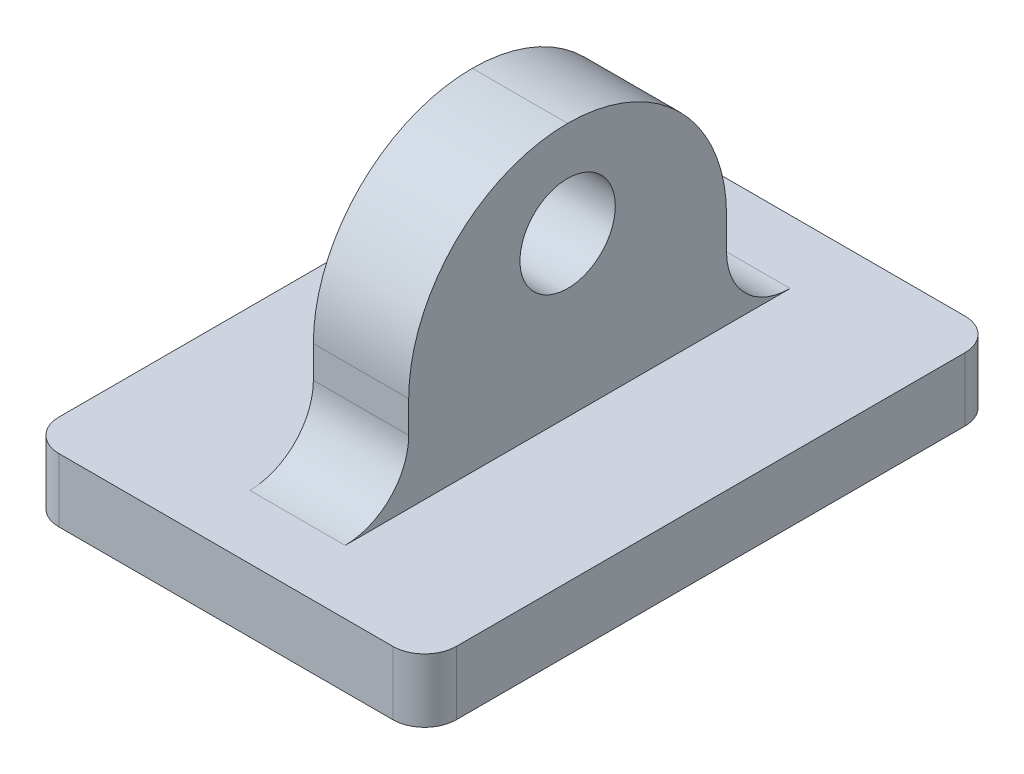
ISO-10303-21;
HEADER;
FILE_DESCRIPTION(('STEP AP214'),'2;1');
FILE_NAME('part.step','',(''),(''),'','','');
FILE_SCHEMA(('AUTOMOTIVE_DESIGN { 1 0 10303 214 1 1 1 1 }'));
ENDSEC;
DATA;
#1=APPLICATION_CONTEXT('core data for automotive mechanical design processes');
#2=APPLICATION_PROTOCOL_DEFINITION('international standard','automotive_design',2000,#1);
#3=PRODUCT_CONTEXT('',#1,'mechanical');
#4=PRODUCT('Part','Part','',(#3));
#5=PRODUCT_RELATED_PRODUCT_CATEGORY('part','',(#4));
#6=PRODUCT_DEFINITION_FORMATION('','',#4);
#7=PRODUCT_DEFINITION_CONTEXT('part definition',#1,'design');
#8=PRODUCT_DEFINITION('design','',#6,#7);
#9=PRODUCT_DEFINITION_SHAPE('','',#8);
#10=(LENGTH_UNIT() NAMED_UNIT(*) SI_UNIT(.MILLI.,.METRE.));
#11=(NAMED_UNIT(*) PLANE_ANGLE_UNIT() SI_UNIT($,.RADIAN.));
#12=(NAMED_UNIT(*) SI_UNIT($,.STERADIAN.) SOLID_ANGLE_UNIT());
#13=UNCERTAINTY_MEASURE_WITH_UNIT(LENGTH_MEASURE(1.E-05),#10,'distance_accuracy_value','');
#14=(GEOMETRIC_REPRESENTATION_CONTEXT(3) GLOBAL_UNCERTAINTY_ASSIGNED_CONTEXT((#13)) GLOBAL_UNIT_ASSIGNED_CONTEXT((#10,
#11,#12)) REPRESENTATION_CONTEXT('',''));
#15=CARTESIAN_POINT('',(0.,0.,0.));
#16=DIRECTION('',(0.,0.,1.));
#17=DIRECTION('',(1.,0.,0.));
#18=AXIS2_PLACEMENT_3D('',#15,#16,#17);
#19=CARTESIAN_POINT('',(-35.,5.,75.));
#20=DIRECTION('',(0.,0.,-1.));
#21=DIRECTION('',(-1.,0.,0.));
#22=AXIS2_PLACEMENT_3D('',#19,#20,#21);
#23=PLANE('',#22);
#24=DIRECTION('',(0.,-1.,0.));
#25=VECTOR('',#24,1.);
#26=CARTESIAN_POINT('',(-1.49999999999997,15.,75.));
#27=LINE('',#26,#25);
#28=CARTESIAN_POINT('',(-1.49999999999997,10.,75.));
#29=VERTEX_POINT('',#28);
#30=CARTESIAN_POINT('',(-1.49999999999997,9.,75.));
#31=VERTEX_POINT('',#30);
#32=EDGE_CURVE('E288',#29,#31,#27,.T.);
#33=ORIENTED_EDGE('',*,*,#32,.T.);
#34=DIRECTION('',(1.,0.,0.));
#35=VECTOR('',#34,1.);
#36=CARTESIAN_POINT('',(-35.,9.,75.));
#37=LINE('',#36,#35);
#38=CARTESIAN_POINT('',(1.50000000000003,9.,75.));
#39=VERTEX_POINT('',#38);
#40=EDGE_CURVE('E192',#31,#39,#37,.T.);
#41=ORIENTED_EDGE('',*,*,#40,.T.);
#42=DIRECTION('',(0.,-1.,0.));
#43=VECTOR('',#42,1.);
#44=CARTESIAN_POINT('',(1.50000000000003,15.,75.));
#45=LINE('',#44,#43);
#46=CARTESIAN_POINT('',(1.50000000000003,10.,75.));
#47=VERTEX_POINT('',#46);
#48=EDGE_CURVE('E286',#47,#39,#45,.T.);
#49=ORIENTED_EDGE('',*,*,#48,.F.);
#50=DIRECTION('',(1.,0.,0.));
#51=VECTOR('',#50,1.);
#52=CARTESIAN_POINT('',(-35.,10.,75.));
#53=LINE('',#52,#51);
#54=EDGE_CURVE('E178',#47,#29,#53,.F.);
#55=ORIENTED_EDGE('',*,*,#54,.T.);
#56=EDGE_LOOP('',(#33,#41,#49,#55));
#57=FACE_BOUND('',#56,.T.);
#58=ADVANCED_FACE('F41',(#57),#23,.F.);
#59=CARTESIAN_POINT('',(1.50000000000003,15.,75.));
#60=DIRECTION('',(-1.,0.,0.));
#61=DIRECTION('',(0.,0.,1.));
#62=AXIS2_PLACEMENT_3D('',#59,#60,#61);
#63=PLANE('',#62);
#64=CARTESIAN_POINT('',(1.50000000000003,12.,70.));
#65=DIRECTION('',(1.,0.,0.));
#66=DIRECTION('',(0.,0.,-1.));
#67=AXIS2_PLACEMENT_3D('',#64,#65,#66);
#68=CIRCLE('',#67,1.5);
#69=CARTESIAN_POINT('',(1.50000000000003,12.,68.5));
#70=VERTEX_POINT('',#69);
#71=EDGE_CURVE('E189',#70,#70,#68,.T.);
#72=ORIENTED_EDGE('',*,*,#71,.F.);
#73=EDGE_LOOP('',(#72));
#74=FACE_BOUND('',#73,.T.);
#75=ORIENTED_EDGE('',*,*,#48,.T.);
#76=CARTESIAN_POINT('',(1.50000000000003,9.,77.));
#77=DIRECTION('',(-1.,0.,0.));
#78=DIRECTION('',(0.,0.,1.));
#79=AXIS2_PLACEMENT_3D('',#76,#77,#78);
#80=CIRCLE('',#79,2.);
#81=CARTESIAN_POINT('',(1.50000000000003,7.,77.));
#82=VERTEX_POINT('',#81);
#83=EDGE_CURVE('E203',#39,#82,#80,.T.);
#84=ORIENTED_EDGE('',*,*,#83,.T.);
#85=DIRECTION('',(0.,0.,-1.));
#86=VECTOR('',#85,1.);
#87=CARTESIAN_POINT('',(1.50000000000003,7.,75.));
#88=LINE('',#87,#86);
#89=CARTESIAN_POINT('',(1.50000000000003,7.,63.));
#90=VERTEX_POINT('',#89);
#91=EDGE_CURVE('E190',#82,#90,#88,.T.);
#92=ORIENTED_EDGE('',*,*,#91,.T.);
#93=CARTESIAN_POINT('',(1.50000000000003,9.,63.));
#94=DIRECTION('',(-1.,0.,0.));
#95=DIRECTION('',(0.,0.,1.));
#96=AXIS2_PLACEMENT_3D('',#93,#94,#95);
#97=CIRCLE('',#96,2.);
#98=CARTESIAN_POINT('',(1.50000000000003,9.,65.));
#99=VERTEX_POINT('',#98);
#100=EDGE_CURVE('E170',#90,#99,#97,.T.);
#101=ORIENTED_EDGE('',*,*,#100,.T.);
#102=DIRECTION('',(0.,-1.,0.));
#103=VECTOR('',#102,1.);
#104=CARTESIAN_POINT('',(1.50000000000003,15.,65.));
#105=LINE('',#104,#103);
#106=CARTESIAN_POINT('',(1.50000000000003,10.,65.));
#107=VERTEX_POINT('',#106);
#108=EDGE_CURVE('E154',#107,#99,#105,.T.);
#109=ORIENTED_EDGE('',*,*,#108,.F.);
#110=CARTESIAN_POINT('',(1.50000000000003,10.,70.));
#111=DIRECTION('',(-1.,0.,0.));
#112=DIRECTION('',(0.,0.,1.));
#113=AXIS2_PLACEMENT_3D('',#110,#111,#112);
#114=CIRCLE('',#113,5.);
#115=CARTESIAN_POINT('',(1.50000000000003,15.,70.));
#116=VERTEX_POINT('',#115);
#117=EDGE_CURVE('E167',#107,#116,#114,.F.);
#118=ORIENTED_EDGE('',*,*,#117,.T.);
#119=CARTESIAN_POINT('',(1.50000000000003,10.,70.));
#120=DIRECTION('',(-1.,0.,0.));
#121=DIRECTION('',(0.,0.,1.));
#122=AXIS2_PLACEMENT_3D('',#119,#120,#121);
#123=CIRCLE('',#122,5.);
#124=EDGE_CURVE('E176',#116,#47,#123,.F.);
#125=ORIENTED_EDGE('',*,*,#124,.T.);
#126=EDGE_LOOP('',(#75,#84,#92,#101,#109,#118,#125));
#127=FACE_BOUND('',#126,.T.);
#128=ADVANCED_FACE('F166',(#74,#127),#63,.F.);
#129=CARTESIAN_POINT('',(-1.49999999999997,15.,65.));
#130=DIRECTION('',(0.,0.,1.));
#131=DIRECTION('',(1.,0.,0.));
#132=AXIS2_PLACEMENT_3D('',#129,#130,#131);
#133=PLANE('',#132);
#134=ORIENTED_EDGE('',*,*,#108,.T.);
#135=DIRECTION('',(-1.,0.,0.));
#136=VECTOR('',#135,1.);
#137=CARTESIAN_POINT('',(-1.49999999999997,9.,65.));
#138=LINE('',#137,#136);
#139=CARTESIAN_POINT('',(-1.49999999999997,9.,65.));
#140=VERTEX_POINT('',#139);
#141=EDGE_CURVE('E201',#99,#140,#138,.T.);
#142=ORIENTED_EDGE('',*,*,#141,.T.);
#143=DIRECTION('',(0.,-1.,0.));
#144=VECTOR('',#143,1.);
#145=CARTESIAN_POINT('',(-1.49999999999997,15.,65.));
#146=LINE('',#145,#144);
#147=CARTESIAN_POINT('',(-1.49999999999997,10.,65.));
#148=VERTEX_POINT('',#147);
#149=EDGE_CURVE('E157',#148,#140,#146,.T.);
#150=ORIENTED_EDGE('',*,*,#149,.F.);
#151=DIRECTION('',(-1.,0.,0.));
#152=VECTOR('',#151,1.);
#153=CARTESIAN_POINT('',(-1.49999999999997,10.,65.));
#154=LINE('',#153,#152);
#155=EDGE_CURVE('E150',#148,#107,#154,.F.);
#156=ORIENTED_EDGE('',*,*,#155,.T.);
#157=EDGE_LOOP('',(#134,#142,#150,#156));
#158=FACE_BOUND('',#157,.T.);
#159=ADVANCED_FACE('F152',(#158),#133,.F.);
#160=CARTESIAN_POINT('',(-1.49999999999997,15.,75.));
#161=DIRECTION('',(1.,0.,0.));
#162=DIRECTION('',(0.,0.,-1.));
#163=AXIS2_PLACEMENT_3D('',#160,#161,#162);
#164=PLANE('',#163);
#165=CARTESIAN_POINT('',(-1.49999999999997,12.,70.));
#166=DIRECTION('',(1.,0.,0.));
#167=DIRECTION('',(0.,0.,-1.));
#168=AXIS2_PLACEMENT_3D('',#165,#166,#167);
#169=CIRCLE('',#168,1.5);
#170=CARTESIAN_POINT('',(-1.49999999999997,12.,68.5));
#171=VERTEX_POINT('',#170);
#172=EDGE_CURVE('E181',#171,#171,#169,.T.);
#173=ORIENTED_EDGE('',*,*,#172,.T.);
#174=EDGE_LOOP('',(#173));
#175=FACE_BOUND('',#174,.T.);
#176=ORIENTED_EDGE('',*,*,#149,.T.);
#177=CARTESIAN_POINT('',(-1.49999999999997,9.,63.));
#178=DIRECTION('',(1.,0.,0.));
#179=DIRECTION('',(0.,0.,-1.));
#180=AXIS2_PLACEMENT_3D('',#177,#178,#179);
#181=CIRCLE('',#180,2.);
#182=CARTESIAN_POINT('',(-1.49999999999997,7.,63.));
#183=VERTEX_POINT('',#182);
#184=EDGE_CURVE('E208',#140,#183,#181,.T.);
#185=ORIENTED_EDGE('',*,*,#184,.T.);
#186=DIRECTION('',(0.,0.,1.));
#187=VECTOR('',#186,1.);
#188=CARTESIAN_POINT('',(-1.49999999999997,7.,75.));
#189=LINE('',#188,#187);
#190=CARTESIAN_POINT('',(-1.49999999999997,7.,77.));
#191=VERTEX_POINT('',#190);
#192=EDGE_CURVE('E161',#183,#191,#189,.T.);
#193=ORIENTED_EDGE('',*,*,#192,.T.);
#194=CARTESIAN_POINT('',(-1.49999999999997,9.,77.));
#195=DIRECTION('',(1.,0.,0.));
#196=DIRECTION('',(0.,0.,-1.));
#197=AXIS2_PLACEMENT_3D('',#194,#195,#196);
#198=CIRCLE('',#197,2.);
#199=EDGE_CURVE('E206',#191,#31,#198,.T.);
#200=ORIENTED_EDGE('',*,*,#199,.T.);
#201=ORIENTED_EDGE('',*,*,#32,.F.);
#202=CARTESIAN_POINT('',(-1.49999999999997,10.,70.));
#203=DIRECTION('',(1.,0.,0.));
#204=DIRECTION('',(0.,0.,-1.));
#205=AXIS2_PLACEMENT_3D('',#202,#203,#204);
#206=CIRCLE('',#205,5.);
#207=CARTESIAN_POINT('',(-1.49999999999997,15.,70.));
#208=VERTEX_POINT('',#207);
#209=EDGE_CURVE('E162',#29,#208,#206,.F.);
#210=ORIENTED_EDGE('',*,*,#209,.T.);
#211=CARTESIAN_POINT('',(-1.49999999999997,10.,70.));
#212=DIRECTION('',(1.,0.,0.));
#213=DIRECTION('',(0.,0.,-1.));
#214=AXIS2_PLACEMENT_3D('',#211,#212,#213);
#215=CIRCLE('',#214,5.);
#216=EDGE_CURVE('E185',#208,#148,#215,.F.);
#217=ORIENTED_EDGE('',*,*,#216,.T.);
#218=EDGE_LOOP('',(#176,#185,#193,#200,#201,#210,#217));
#219=FACE_BOUND('',#218,.T.);
#220=ADVANCED_FACE('F292',(#175,#219),#164,.F.);
#221=CARTESIAN_POINT('',(-35.,12.,70.));
#222=DIRECTION('',(1.,0.,0.));
#223=DIRECTION('',(0.,0.,-1.));
#224=AXIS2_PLACEMENT_3D('',#221,#222,#223);
#225=CYLINDRICAL_SURFACE('',#224,1.5);
#226=ORIENTED_EDGE('',*,*,#71,.T.);
#227=EDGE_LOOP('',(#226));
#228=FACE_BOUND('',#227,.T.);
#229=ORIENTED_EDGE('',*,*,#172,.F.);
#230=EDGE_LOOP('',(#229));
#231=FACE_BOUND('',#230,.T.);
#232=ADVANCED_FACE('F330',(#228,#231),#225,.F.);
#233=CARTESIAN_POINT('',(0.,10.,70.));
#234=DIRECTION('',(-1.,0.,0.));
#235=DIRECTION('',(0.,0.,1.));
#236=AXIS2_PLACEMENT_3D('',#233,#234,#235);
#237=CYLINDRICAL_SURFACE('',#236,5.);
#238=ORIENTED_EDGE('',*,*,#155,.F.);
#239=ORIENTED_EDGE('',*,*,#216,.F.);
#240=DIRECTION('',(-1.,0.,0.));
#241=VECTOR('',#240,1.);
#242=CARTESIAN_POINT('',(0.,15.,70.));
#243=LINE('',#242,#241);
#244=EDGE_CURVE('E174',#116,#208,#243,.T.);
#245=ORIENTED_EDGE('',*,*,#244,.F.);
#246=ORIENTED_EDGE('',*,*,#117,.F.);
#247=EDGE_LOOP('',(#238,#239,#245,#246));
#248=FACE_BOUND('',#247,.T.);
#249=ADVANCED_FACE('F172',(#248),#237,.T.);
#250=CARTESIAN_POINT('',(0.,10.,70.));
#251=DIRECTION('',(1.,0.,0.));
#252=DIRECTION('',(0.,0.,-1.));
#253=AXIS2_PLACEMENT_3D('',#250,#251,#252);
#254=CYLINDRICAL_SURFACE('',#253,5.);
#255=ORIENTED_EDGE('',*,*,#209,.F.);
#256=ORIENTED_EDGE('',*,*,#54,.F.);
#257=ORIENTED_EDGE('',*,*,#124,.F.);
#258=ORIENTED_EDGE('',*,*,#244,.T.);
#259=EDGE_LOOP('',(#255,#256,#257,#258));
#260=FACE_BOUND('',#259,.T.);
#261=ADVANCED_FACE('F296',(#260),#254,.T.);
#262=CARTESIAN_POINT('',(6.00000000000003,7.,61.));
#263=DIRECTION('',(0.,1.,0.));
#264=DIRECTION('',(0.,0.,1.));
#265=AXIS2_PLACEMENT_3D('',#262,#263,#264);
#266=PLANE('',#265);
#267=DIRECTION('',(-1.,0.,0.));
#268=VECTOR('',#267,1.);
#269=CARTESIAN_POINT('',(6.00000000000003,7.,61.));
#270=LINE('',#269,#268);
#271=CARTESIAN_POINT('',(5.00000000000003,7.,61.));
#272=VERTEX_POINT('',#271);
#273=CARTESIAN_POINT('',(-5.49999999999997,7.,61.));
#274=VERTEX_POINT('',#273);
#275=EDGE_CURVE('E278',#272,#274,#270,.T.);
#276=ORIENTED_EDGE('',*,*,#275,.T.);
#277=CARTESIAN_POINT('',(-5.49999999999997,7.,62.));
#278=DIRECTION('',(0.,1.,0.));
#279=DIRECTION('',(0.,0.,1.));
#280=AXIS2_PLACEMENT_3D('',#277,#278,#279);
#281=CIRCLE('',#280,1.);
#282=CARTESIAN_POINT('',(-6.49999999999997,7.,62.));
#283=VERTEX_POINT('',#282);
#284=EDGE_CURVE('E236',#274,#283,#281,.T.);
#285=ORIENTED_EDGE('',*,*,#284,.T.);
#286=DIRECTION('',(0.,0.,-1.));
#287=VECTOR('',#286,1.);
#288=CARTESIAN_POINT('',(-6.49999999999997,7.,61.));
#289=LINE('',#288,#287);
#290=CARTESIAN_POINT('',(-6.49999999999997,7.,78.));
#291=VERTEX_POINT('',#290);
#292=EDGE_CURVE('E264',#291,#283,#289,.T.);
#293=ORIENTED_EDGE('',*,*,#292,.F.);
#294=CARTESIAN_POINT('',(-5.49999999999997,7.,78.));
#295=DIRECTION('',(0.,1.,0.));
#296=DIRECTION('',(0.,0.,1.));
#297=AXIS2_PLACEMENT_3D('',#294,#295,#296);
#298=CIRCLE('',#297,1.);
#299=CARTESIAN_POINT('',(-5.49999999999997,7.,79.));
#300=VERTEX_POINT('',#299);
#301=EDGE_CURVE('E231',#291,#300,#298,.T.);
#302=ORIENTED_EDGE('',*,*,#301,.T.);
#303=DIRECTION('',(-1.,0.,0.));
#304=VECTOR('',#303,1.);
#305=CARTESIAN_POINT('',(6.00000000000003,7.,79.));
#306=LINE('',#305,#304);
#307=CARTESIAN_POINT('',(5.00000000000003,7.,79.));
#308=VERTEX_POINT('',#307);
#309=EDGE_CURVE('E248',#308,#300,#306,.T.);
#310=ORIENTED_EDGE('',*,*,#309,.F.);
#311=CARTESIAN_POINT('',(5.00000000000003,7.,78.));
#312=DIRECTION('',(0.,1.,0.));
#313=DIRECTION('',(0.,0.,1.));
#314=AXIS2_PLACEMENT_3D('',#311,#312,#313);
#315=CIRCLE('',#314,1.);
#316=CARTESIAN_POINT('',(6.00000000000003,7.,78.));
#317=VERTEX_POINT('',#316);
#318=EDGE_CURVE('E63',#308,#317,#315,.T.);
#319=ORIENTED_EDGE('',*,*,#318,.T.);
#320=DIRECTION('',(0.,0.,-1.));
#321=VECTOR('',#320,1.);
#322=CARTESIAN_POINT('',(6.00000000000003,7.,61.));
#323=LINE('',#322,#321);
#324=CARTESIAN_POINT('',(6.00000000000003,7.,62.));
#325=VERTEX_POINT('',#324);
#326=EDGE_CURVE('E273',#317,#325,#323,.T.);
#327=ORIENTED_EDGE('',*,*,#326,.T.);
#328=CARTESIAN_POINT('',(5.00000000000003,7.,62.));
#329=DIRECTION('',(0.,1.,0.));
#330=DIRECTION('',(0.,0.,1.));
#331=AXIS2_PLACEMENT_3D('',#328,#329,#330);
#332=CIRCLE('',#331,1.);
#333=EDGE_CURVE('E234',#325,#272,#332,.T.);
#334=ORIENTED_EDGE('',*,*,#333,.T.);
#335=EDGE_LOOP('',(#276,#285,#293,#302,#310,#319,#327,#334));
#336=FACE_BOUND('',#335,.T.);
#337=ORIENTED_EDGE('',*,*,#91,.F.);
#338=DIRECTION('',(1.,0.,0.));
#339=VECTOR('',#338,1.);
#340=CARTESIAN_POINT('',(6.00000000000003,7.,77.));
#341=LINE('',#340,#339);
#342=EDGE_CURVE('E198',#82,#191,#341,.F.);
#343=ORIENTED_EDGE('',*,*,#342,.T.);
#344=ORIENTED_EDGE('',*,*,#192,.F.);
#345=DIRECTION('',(-1.,0.,0.));
#346=VECTOR('',#345,1.);
#347=CARTESIAN_POINT('',(6.00000000000003,7.,63.));
#348=LINE('',#347,#346);
#349=EDGE_CURVE('E195',#183,#90,#348,.F.);
#350=ORIENTED_EDGE('',*,*,#349,.T.);
#351=EDGE_LOOP('',(#337,#343,#344,#350));
#352=FACE_BOUND('',#351,.T.);
#353=ADVANCED_FACE('F268',(#336,#352),#266,.T.);
#354=CARTESIAN_POINT('',(6.00000000000003,7.,61.));
#355=DIRECTION('',(0.,0.,-1.));
#356=DIRECTION('',(-1.,0.,0.));
#357=AXIS2_PLACEMENT_3D('',#354,#355,#356);
#358=PLANE('',#357);
#359=DIRECTION('',(-1.,0.,0.));
#360=VECTOR('',#359,1.);
#361=CARTESIAN_POINT('',(6.00000000000003,5.,61.));
#362=LINE('',#361,#360);
#363=CARTESIAN_POINT('',(5.00000000000003,5.,61.));
#364=VERTEX_POINT('',#363);
#365=CARTESIAN_POINT('',(-5.49999999999997,5.,61.));
#366=VERTEX_POINT('',#365);
#367=EDGE_CURVE('E257',#364,#366,#362,.T.);
#368=ORIENTED_EDGE('',*,*,#367,.T.);
#369=DIRECTION('',(0.,-1.,0.));
#370=VECTOR('',#369,1.);
#371=CARTESIAN_POINT('',(-5.49999999999997,7.,61.));
#372=LINE('',#371,#370);
#373=EDGE_CURVE('E229',#366,#274,#372,.F.);
#374=ORIENTED_EDGE('',*,*,#373,.T.);
#375=ORIENTED_EDGE('',*,*,#275,.F.);
#376=DIRECTION('',(0.,-1.,0.));
#377=VECTOR('',#376,1.);
#378=CARTESIAN_POINT('',(5.00000000000003,5.,61.));
#379=LINE('',#378,#377);
#380=EDGE_CURVE('E226',#272,#364,#379,.T.);
#381=ORIENTED_EDGE('',*,*,#380,.T.);
#382=EDGE_LOOP('',(#368,#374,#375,#381));
#383=FACE_BOUND('',#382,.T.);
#384=ADVANCED_FACE('F376',(#383),#358,.T.);
#385=CARTESIAN_POINT('',(6.00000000000003,7.,79.));
#386=DIRECTION('',(0.,0.,1.));
#387=DIRECTION('',(1.,0.,0.));
#388=AXIS2_PLACEMENT_3D('',#385,#386,#387);
#389=PLANE('',#388);
#390=DIRECTION('',(-1.,0.,0.));
#391=VECTOR('',#390,1.);
#392=CARTESIAN_POINT('',(6.00000000000003,5.,79.));
#393=LINE('',#392,#391);
#394=CARTESIAN_POINT('',(5.00000000000003,5.,79.));
#395=VERTEX_POINT('',#394);
#396=CARTESIAN_POINT('',(-5.49999999999997,5.,79.));
#397=VERTEX_POINT('',#396);
#398=EDGE_CURVE('E246',#395,#397,#393,.T.);
#399=ORIENTED_EDGE('',*,*,#398,.F.);
#400=DIRECTION('',(0.,1.,0.));
#401=VECTOR('',#400,1.);
#402=CARTESIAN_POINT('',(5.00000000000003,7.,79.));
#403=LINE('',#402,#401);
#404=EDGE_CURVE('E11',#395,#308,#403,.T.);
#405=ORIENTED_EDGE('',*,*,#404,.T.);
#406=ORIENTED_EDGE('',*,*,#309,.T.);
#407=DIRECTION('',(0.,1.,0.));
#408=VECTOR('',#407,1.);
#409=CARTESIAN_POINT('',(-5.49999999999997,7.,79.));
#410=LINE('',#409,#408);
#411=EDGE_CURVE('E49',#300,#397,#410,.F.);
#412=ORIENTED_EDGE('',*,*,#411,.T.);
#413=EDGE_LOOP('',(#399,#405,#406,#412));
#414=FACE_BOUND('',#413,.T.);
#415=ADVANCED_FACE('F245',(#414),#389,.T.);
#416=CARTESIAN_POINT('',(6.00000000000003,0.,0.));
#417=DIRECTION('',(-1.,0.,0.));
#418=DIRECTION('',(0.,0.,1.));
#419=AXIS2_PLACEMENT_3D('',#416,#417,#418);
#420=PLANE('',#419);
#421=DIRECTION('',(0.,0.,1.));
#422=VECTOR('',#421,1.);
#423=CARTESIAN_POINT('',(6.00000000000003,5.,61.));
#424=LINE('',#423,#422);
#425=CARTESIAN_POINT('',(6.00000000000003,5.,62.));
#426=VERTEX_POINT('',#425);
#427=CARTESIAN_POINT('',(6.00000000000003,5.,78.));
#428=VERTEX_POINT('',#427);
#429=EDGE_CURVE('E271',#426,#428,#424,.T.);
#430=ORIENTED_EDGE('',*,*,#429,.F.);
#431=DIRECTION('',(0.,-1.,0.));
#432=VECTOR('',#431,1.);
#433=CARTESIAN_POINT('',(6.00000000000003,7.,62.));
#434=LINE('',#433,#432);
#435=EDGE_CURVE('E56',#426,#325,#434,.F.);
#436=ORIENTED_EDGE('',*,*,#435,.T.);
#437=ORIENTED_EDGE('',*,*,#326,.F.);
#438=DIRECTION('',(0.,1.,0.));
#439=VECTOR('',#438,1.);
#440=CARTESIAN_POINT('',(6.00000000000003,5.,78.));
#441=LINE('',#440,#439);
#442=EDGE_CURVE('E238',#317,#428,#441,.F.);
#443=ORIENTED_EDGE('',*,*,#442,.T.);
#444=EDGE_LOOP('',(#430,#436,#437,#443));
#445=FACE_BOUND('',#444,.T.);
#446=ADVANCED_FACE('F394',(#445),#420,.F.);
#447=CARTESIAN_POINT('',(-6.49999999999997,0.,0.));
#448=DIRECTION('',(-1.,0.,0.));
#449=DIRECTION('',(0.,0.,1.));
#450=AXIS2_PLACEMENT_3D('',#447,#448,#449);
#451=PLANE('',#450);
#452=ORIENTED_EDGE('',*,*,#292,.T.);
#453=DIRECTION('',(0.,-1.,0.));
#454=VECTOR('',#453,1.);
#455=CARTESIAN_POINT('',(-6.49999999999997,0.,62.));
#456=LINE('',#455,#454);
#457=CARTESIAN_POINT('',(-6.49999999999997,5.,62.));
#458=VERTEX_POINT('',#457);
#459=EDGE_CURVE('E215',#283,#458,#456,.T.);
#460=ORIENTED_EDGE('',*,*,#459,.T.);
#461=DIRECTION('',(0.,0.,1.));
#462=VECTOR('',#461,1.);
#463=CARTESIAN_POINT('',(-6.49999999999997,5.,61.));
#464=LINE('',#463,#462);
#465=CARTESIAN_POINT('',(-6.49999999999997,5.,78.));
#466=VERTEX_POINT('',#465);
#467=EDGE_CURVE('E266',#458,#466,#464,.T.);
#468=ORIENTED_EDGE('',*,*,#467,.T.);
#469=DIRECTION('',(0.,1.,0.));
#470=VECTOR('',#469,1.);
#471=CARTESIAN_POINT('',(-6.49999999999997,0.,78.));
#472=LINE('',#471,#470);
#473=EDGE_CURVE('E212',#466,#291,#472,.T.);
#474=ORIENTED_EDGE('',*,*,#473,.T.);
#475=EDGE_LOOP('',(#452,#460,#468,#474));
#476=FACE_BOUND('',#475,.T.);
#477=ADVANCED_FACE('F263',(#476),#451,.T.);
#478=CARTESIAN_POINT('',(52.,5.,-5.9776672525927));
#479=DIRECTION('',(0.,1.,0.));
#480=DIRECTION('',(0.,0.,1.));
#481=AXIS2_PLACEMENT_3D('',#478,#479,#480);
#482=PLANE('',#481);
#483=ORIENTED_EDGE('',*,*,#467,.F.);
#484=CARTESIAN_POINT('',(-5.49999999999997,5.,62.));
#485=DIRECTION('',(0.,1.,0.));
#486=DIRECTION('',(0.,0.,1.));
#487=AXIS2_PLACEMENT_3D('',#484,#485,#486);
#488=CIRCLE('',#487,1.);
#489=EDGE_CURVE('E224',#458,#366,#488,.F.);
#490=ORIENTED_EDGE('',*,*,#489,.T.);
#491=ORIENTED_EDGE('',*,*,#367,.F.);
#492=CARTESIAN_POINT('',(5.00000000000003,5.,62.));
#493=DIRECTION('',(0.,1.,0.));
#494=DIRECTION('',(0.,0.,1.));
#495=AXIS2_PLACEMENT_3D('',#492,#493,#494);
#496=CIRCLE('',#495,1.);
#497=EDGE_CURVE('E222',#364,#426,#496,.F.);
#498=ORIENTED_EDGE('',*,*,#497,.T.);
#499=ORIENTED_EDGE('',*,*,#429,.T.);
#500=CARTESIAN_POINT('',(5.00000000000003,5.,78.));
#501=DIRECTION('',(0.,1.,0.));
#502=DIRECTION('',(0.,0.,1.));
#503=AXIS2_PLACEMENT_3D('',#500,#501,#502);
#504=CIRCLE('',#503,1.);
#505=EDGE_CURVE('E220',#428,#395,#504,.F.);
#506=ORIENTED_EDGE('',*,*,#505,.T.);
#507=ORIENTED_EDGE('',*,*,#398,.T.);
#508=CARTESIAN_POINT('',(-5.49999999999997,5.,78.));
#509=DIRECTION('',(0.,1.,0.));
#510=DIRECTION('',(0.,0.,1.));
#511=AXIS2_PLACEMENT_3D('',#508,#509,#510);
#512=CIRCLE('',#511,1.);
#513=EDGE_CURVE('E218',#397,#466,#512,.F.);
#514=ORIENTED_EDGE('',*,*,#513,.T.);
#515=EDGE_LOOP('',(#483,#490,#491,#498,#499,#506,#507,#514));
#516=FACE_BOUND('',#515,.T.);
#517=ADVANCED_FACE('F253',(#516),#482,.F.);
#518=CARTESIAN_POINT('',(-35.,9.,77.));
#519=DIRECTION('',(1.,0.,0.));
#520=DIRECTION('',(0.,0.,-1.));
#521=AXIS2_PLACEMENT_3D('',#518,#519,#520);
#522=CYLINDRICAL_SURFACE('',#521,2.);
#523=ORIENTED_EDGE('',*,*,#199,.F.);
#524=ORIENTED_EDGE('',*,*,#342,.F.);
#525=ORIENTED_EDGE('',*,*,#83,.F.);
#526=ORIENTED_EDGE('',*,*,#40,.F.);
#527=EDGE_LOOP('',(#523,#524,#525,#526));
#528=FACE_BOUND('',#527,.T.);
#529=ADVANCED_FACE('F303',(#528),#522,.F.);
#530=CARTESIAN_POINT('',(-1.49999999999997,9.,63.));
#531=DIRECTION('',(-1.,0.,0.));
#532=DIRECTION('',(0.,0.,1.));
#533=AXIS2_PLACEMENT_3D('',#530,#531,#532);
#534=CYLINDRICAL_SURFACE('',#533,2.);
#535=ORIENTED_EDGE('',*,*,#100,.F.);
#536=ORIENTED_EDGE('',*,*,#349,.F.);
#537=ORIENTED_EDGE('',*,*,#184,.F.);
#538=ORIENTED_EDGE('',*,*,#141,.F.);
#539=EDGE_LOOP('',(#535,#536,#537,#538));
#540=FACE_BOUND('',#539,.T.);
#541=ADVANCED_FACE('F306',(#540),#534,.F.);
#542=CARTESIAN_POINT('',(-5.49999999999997,0.,62.));
#543=DIRECTION('',(0.,-1.,0.));
#544=DIRECTION('',(0.,0.,-1.));
#545=AXIS2_PLACEMENT_3D('',#542,#543,#544);
#546=CYLINDRICAL_SURFACE('',#545,1.);
#547=ORIENTED_EDGE('',*,*,#284,.F.);
#548=ORIENTED_EDGE('',*,*,#373,.F.);
#549=ORIENTED_EDGE('',*,*,#489,.F.);
#550=ORIENTED_EDGE('',*,*,#459,.F.);
#551=EDGE_LOOP('',(#547,#548,#549,#550));
#552=FACE_BOUND('',#551,.T.);
#553=ADVANCED_FACE('F308',(#552),#546,.T.);
#554=CARTESIAN_POINT('',(5.00000000000003,7.,62.));
#555=DIRECTION('',(0.,1.,0.));
#556=DIRECTION('',(0.,0.,1.));
#557=AXIS2_PLACEMENT_3D('',#554,#555,#556);
#558=CYLINDRICAL_SURFACE('',#557,1.);
#559=ORIENTED_EDGE('',*,*,#333,.F.);
#560=ORIENTED_EDGE('',*,*,#435,.F.);
#561=ORIENTED_EDGE('',*,*,#497,.F.);
#562=ORIENTED_EDGE('',*,*,#380,.F.);
#563=EDGE_LOOP('',(#559,#560,#561,#562));
#564=FACE_BOUND('',#563,.T.);
#565=ADVANCED_FACE('F314',(#564),#558,.T.);
#566=CARTESIAN_POINT('',(5.00000000000003,7.,78.));
#567=DIRECTION('',(0.,-1.,0.));
#568=DIRECTION('',(0.,0.,-1.));
#569=AXIS2_PLACEMENT_3D('',#566,#567,#568);
#570=CYLINDRICAL_SURFACE('',#569,1.);
#571=ORIENTED_EDGE('',*,*,#505,.F.);
#572=ORIENTED_EDGE('',*,*,#442,.F.);
#573=ORIENTED_EDGE('',*,*,#318,.F.);
#574=ORIENTED_EDGE('',*,*,#404,.F.);
#575=EDGE_LOOP('',(#571,#572,#573,#574));
#576=FACE_BOUND('',#575,.T.);
#577=ADVANCED_FACE('F429',(#576),#570,.T.);
#578=CARTESIAN_POINT('',(-5.49999999999997,0.,78.));
#579=DIRECTION('',(0.,1.,0.));
#580=DIRECTION('',(0.,0.,1.));
#581=AXIS2_PLACEMENT_3D('',#578,#579,#580);
#582=CYLINDRICAL_SURFACE('',#581,1.);
#583=ORIENTED_EDGE('',*,*,#513,.F.);
#584=ORIENTED_EDGE('',*,*,#411,.F.);
#585=ORIENTED_EDGE('',*,*,#301,.F.);
#586=ORIENTED_EDGE('',*,*,#473,.F.);
#587=EDGE_LOOP('',(#583,#584,#585,#586));
#588=FACE_BOUND('',#587,.T.);
#589=ADVANCED_FACE('F43',(#588),#582,.T.);
#590=CLOSED_SHELL('',(#58,#128,#159,#220,#232,#249,#261,#353,#384,#415,#446,#477,#517,#529,#541,
#553,#565,#577,#589));
#591=MANIFOLD_SOLID_BREP('B2',#590);
#592=ADVANCED_BREP_SHAPE_REPRESENTATION('',(#18,#591),#14);
#593=SHAPE_DEFINITION_REPRESENTATION(#9,#592);
ENDSEC;
END-ISO-10303-21;
